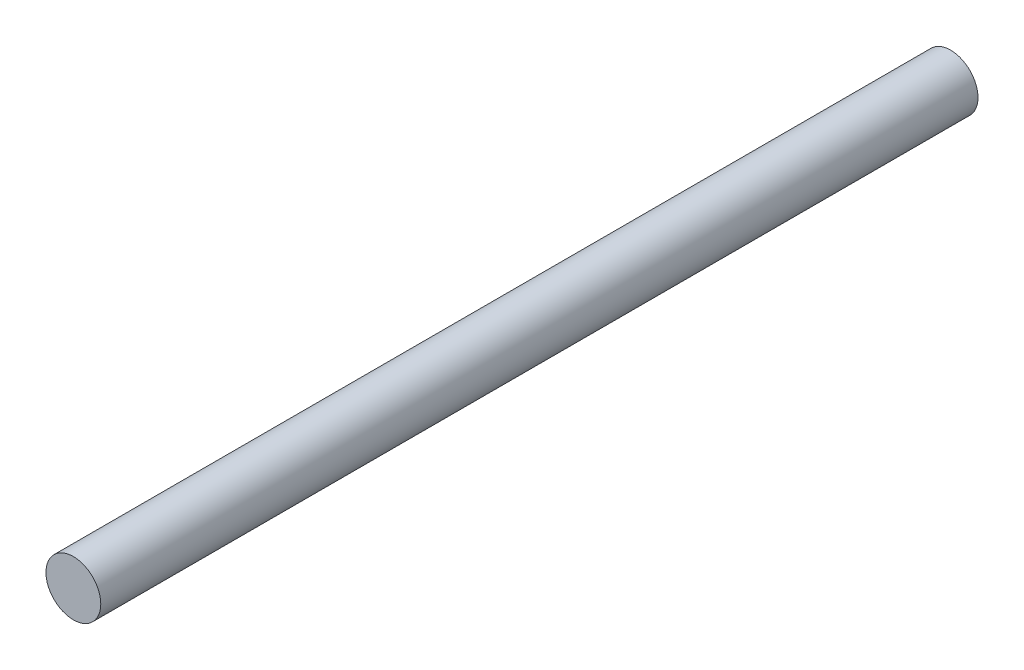
ISO-10303-21;
HEADER;
FILE_DESCRIPTION(('STEP AP214'),'2;1');
FILE_NAME('part.step','',(''),(''),'','','');
FILE_SCHEMA(('AUTOMOTIVE_DESIGN { 1 0 10303 214 1 1 1 1 }'));
ENDSEC;
DATA;
#1=APPLICATION_CONTEXT('core data for automotive mechanical design processes');
#2=APPLICATION_PROTOCOL_DEFINITION('international standard','automotive_design',2000,#1);
#3=PRODUCT_CONTEXT('',#1,'mechanical');
#4=PRODUCT('Part','Part','',(#3));
#5=PRODUCT_RELATED_PRODUCT_CATEGORY('part','',(#4));
#6=PRODUCT_DEFINITION_FORMATION('','',#4);
#7=PRODUCT_DEFINITION_CONTEXT('part definition',#1,'design');
#8=PRODUCT_DEFINITION('design','',#6,#7);
#9=PRODUCT_DEFINITION_SHAPE('','',#8);
#10=(LENGTH_UNIT() NAMED_UNIT(*) SI_UNIT(.MILLI.,.METRE.));
#11=(NAMED_UNIT(*) PLANE_ANGLE_UNIT() SI_UNIT($,.RADIAN.));
#12=(NAMED_UNIT(*) SI_UNIT($,.STERADIAN.) SOLID_ANGLE_UNIT());
#13=UNCERTAINTY_MEASURE_WITH_UNIT(LENGTH_MEASURE(1.E-05),#10,'distance_accuracy_value','');
#14=(GEOMETRIC_REPRESENTATION_CONTEXT(3) GLOBAL_UNCERTAINTY_ASSIGNED_CONTEXT((#13)) GLOBAL_UNIT_ASSIGNED_CONTEXT((#10,
#11,#12)) REPRESENTATION_CONTEXT('',''));
#15=CARTESIAN_POINT('',(0.,0.,0.));
#16=DIRECTION('',(0.,0.,1.));
#17=DIRECTION('',(1.,0.,0.));
#18=AXIS2_PLACEMENT_3D('',#15,#16,#17);
#19=CARTESIAN_POINT('',(0.,0.,96.));
#20=DIRECTION('',(0.,0.,-1.));
#21=DIRECTION('',(-1.,0.,0.));
#22=AXIS2_PLACEMENT_3D('',#19,#20,#21);
#23=CYLINDRICAL_SURFACE('',#22,3.);
#24=CARTESIAN_POINT('',(0.,0.,96.));
#25=DIRECTION('',(0.,0.,1.));
#26=DIRECTION('',(1.,0.,0.));
#27=AXIS2_PLACEMENT_3D('',#24,#25,#26);
#28=CIRCLE('',#27,3.);
#29=CARTESIAN_POINT('',(3.,0.,96.));
#30=VERTEX_POINT('',#29);
#31=EDGE_CURVE('E10',#30,#30,#28,.T.);
#32=ORIENTED_EDGE('',*,*,#31,.F.);
#33=EDGE_LOOP('',(#32));
#34=FACE_BOUND('',#33,.T.);
#35=CARTESIAN_POINT('',(0.,0.,0.));
#36=DIRECTION('',(0.,0.,1.));
#37=DIRECTION('',(1.,0.,0.));
#38=AXIS2_PLACEMENT_3D('',#35,#36,#37);
#39=CIRCLE('',#38,3.);
#40=CARTESIAN_POINT('',(3.,0.,0.));
#41=VERTEX_POINT('',#40);
#42=EDGE_CURVE('E34',#41,#41,#39,.T.);
#43=ORIENTED_EDGE('',*,*,#42,.T.);
#44=EDGE_LOOP('',(#43));
#45=FACE_BOUND('',#44,.T.);
#46=ADVANCED_FACE('F31',(#34,#45),#23,.T.);
#47=CARTESIAN_POINT('',(0.,0.,96.));
#48=DIRECTION('',(0.,0.,1.));
#49=DIRECTION('',(1.,0.,0.));
#50=AXIS2_PLACEMENT_3D('',#47,#48,#49);
#51=PLANE('',#50);
#52=ORIENTED_EDGE('',*,*,#31,.T.);
#53=EDGE_LOOP('',(#52));
#54=FACE_BOUND('',#53,.T.);
#55=ADVANCED_FACE('F46',(#54),#51,.T.);
#56=CARTESIAN_POINT('',(0.,0.,0.));
#57=DIRECTION('',(0.,0.,1.));
#58=DIRECTION('',(1.,0.,0.));
#59=AXIS2_PLACEMENT_3D('',#56,#57,#58);
#60=PLANE('',#59);
#61=ORIENTED_EDGE('',*,*,#42,.F.);
#62=EDGE_LOOP('',(#61));
#63=FACE_BOUND('',#62,.T.);
#64=ADVANCED_FACE('F44',(#63),#60,.F.);
#65=CLOSED_SHELL('',(#46,#55,#64));
#66=MANIFOLD_SOLID_BREP('B2',#65);
#67=ADVANCED_BREP_SHAPE_REPRESENTATION('',(#18,#66),#14);
#68=SHAPE_DEFINITION_REPRESENTATION(#9,#67);
ENDSEC;
END-ISO-10303-21;
